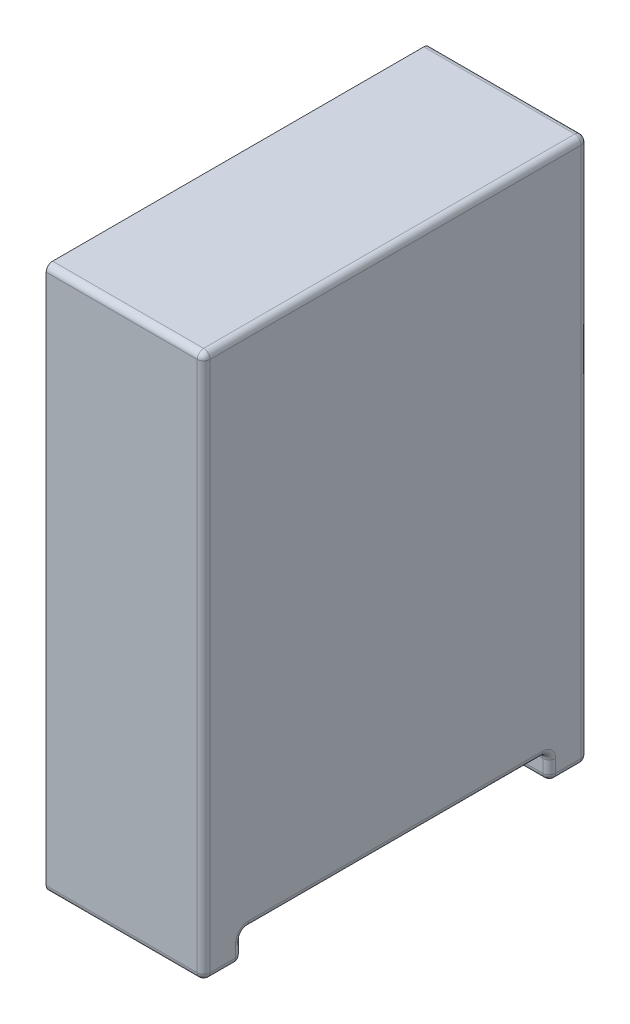
ISO-10303-21;
HEADER;
FILE_DESCRIPTION(('STEP AP214'),'2;1');
FILE_NAME('part.step','',(''),(''),'','','');
FILE_SCHEMA(('AUTOMOTIVE_DESIGN { 1 0 10303 214 1 1 1 1 }'));
ENDSEC;
DATA;
#1=APPLICATION_CONTEXT('core data for automotive mechanical design processes');
#2=APPLICATION_PROTOCOL_DEFINITION('international standard','automotive_design',2000,#1);
#3=PRODUCT_CONTEXT('',#1,'mechanical');
#4=PRODUCT('Part','Part','',(#3));
#5=PRODUCT_RELATED_PRODUCT_CATEGORY('part','',(#4));
#6=PRODUCT_DEFINITION_FORMATION('','',#4);
#7=PRODUCT_DEFINITION_CONTEXT('part definition',#1,'design');
#8=PRODUCT_DEFINITION('design','',#6,#7);
#9=PRODUCT_DEFINITION_SHAPE('','',#8);
#10=(LENGTH_UNIT() NAMED_UNIT(*) SI_UNIT(.MILLI.,.METRE.));
#11=(NAMED_UNIT(*) PLANE_ANGLE_UNIT() SI_UNIT($,.RADIAN.));
#12=(NAMED_UNIT(*) SI_UNIT($,.STERADIAN.) SOLID_ANGLE_UNIT());
#13=UNCERTAINTY_MEASURE_WITH_UNIT(LENGTH_MEASURE(1.E-05),#10,'distance_accuracy_value','');
#14=(GEOMETRIC_REPRESENTATION_CONTEXT(3) GLOBAL_UNCERTAINTY_ASSIGNED_CONTEXT((#13)) GLOBAL_UNIT_ASSIGNED_CONTEXT((#10,
#11,#12)) REPRESENTATION_CONTEXT('',''));
#15=CARTESIAN_POINT('',(0.,0.,0.));
#16=DIRECTION('',(0.,0.,1.));
#17=DIRECTION('',(1.,0.,0.));
#18=AXIS2_PLACEMENT_3D('',#15,#16,#17);
#19=CARTESIAN_POINT('',(-0.1,-4.35,-2.5));
#20=DIRECTION('',(1.,0.,0.));
#21=DIRECTION('',(0.,0.,-1.));
#22=AXIS2_PLACEMENT_3D('',#19,#20,#21);
#23=SPHERICAL_SURFACE('',#22,0.1);
#24=CARTESIAN_POINT('',(-0.1,-4.35,-2.5));
#25=DIRECTION('',(-1.,0.,0.));
#26=DIRECTION('',(0.,0.,1.));
#27=AXIS2_PLACEMENT_3D('',#24,#25,#26);
#28=CIRCLE('',#27,0.0999999999999998);
#29=CARTESIAN_POINT('',(-0.1,-4.45,-2.5));
#30=VERTEX_POINT('',#29);
#31=CARTESIAN_POINT('',(-0.0999999999999999,-4.35,-2.4));
#32=VERTEX_POINT('',#31);
#33=EDGE_CURVE('E94',#30,#32,#28,.T.);
#34=ORIENTED_EDGE('',*,*,#33,.F.);
#35=CARTESIAN_POINT('',(-0.1,-4.35,-2.5));
#36=DIRECTION('',(0.,0.,-1.));
#37=DIRECTION('',(-1.,0.,0.));
#38=AXIS2_PLACEMENT_3D('',#35,#36,#37);
#39=CIRCLE('',#38,0.1);
#40=CARTESIAN_POINT('',(0.,-4.35,-2.5));
#41=VERTEX_POINT('',#40);
#42=EDGE_CURVE('E161',#41,#30,#39,.T.);
#43=ORIENTED_EDGE('',*,*,#42,.F.);
#44=CARTESIAN_POINT('',(-0.0999999999999998,-4.35,-2.5));
#45=DIRECTION('',(0.,-1.,0.));
#46=DIRECTION('',(0.,0.,-1.));
#47=AXIS2_PLACEMENT_3D('',#44,#45,#46);
#48=CIRCLE('',#47,0.0999999999999998);
#49=EDGE_CURVE('E153',#32,#41,#48,.F.);
#50=ORIENTED_EDGE('',*,*,#49,.F.);
#51=EDGE_LOOP('',(#34,#43,#50));
#52=FACE_BOUND('',#51,.T.);
#53=ADVANCED_FACE('F17',(#52),#23,.T.);
#54=CARTESIAN_POINT('',(-0.1,-4.35,2.5));
#55=DIRECTION('',(1.,0.,0.));
#56=DIRECTION('',(0.,0.,-1.));
#57=AXIS2_PLACEMENT_3D('',#54,#55,#56);
#58=SPHERICAL_SURFACE('',#57,0.1);
#59=CARTESIAN_POINT('',(-0.1,-4.35,2.5));
#60=DIRECTION('',(0.,-1.,0.));
#61=DIRECTION('',(0.,0.,-1.));
#62=AXIS2_PLACEMENT_3D('',#59,#60,#61);
#63=CIRCLE('',#62,0.0999999999999998);
#64=CARTESIAN_POINT('',(0.,-4.35,2.5));
#65=VERTEX_POINT('',#64);
#66=CARTESIAN_POINT('',(-0.0999999999999999,-4.35,2.4));
#67=VERTEX_POINT('',#66);
#68=EDGE_CURVE('E162',#65,#67,#63,.F.);
#69=ORIENTED_EDGE('',*,*,#68,.F.);
#70=CARTESIAN_POINT('',(-0.1,-4.35,2.5));
#71=DIRECTION('',(0.,0.,1.));
#72=DIRECTION('',(1.,0.,0.));
#73=AXIS2_PLACEMENT_3D('',#70,#71,#72);
#74=CIRCLE('',#73,0.1);
#75=CARTESIAN_POINT('',(-0.1,-4.45,2.5));
#76=VERTEX_POINT('',#75);
#77=EDGE_CURVE('E269',#76,#65,#74,.T.);
#78=ORIENTED_EDGE('',*,*,#77,.F.);
#79=CARTESIAN_POINT('',(-0.1,-4.35,2.5));
#80=DIRECTION('',(-1.,0.,0.));
#81=DIRECTION('',(0.,0.,1.));
#82=AXIS2_PLACEMENT_3D('',#79,#80,#81);
#83=CIRCLE('',#82,0.0999999999999998);
#84=EDGE_CURVE('E528',#67,#76,#83,.T.);
#85=ORIENTED_EDGE('',*,*,#84,.F.);
#86=EDGE_LOOP('',(#69,#78,#85));
#87=FACE_BOUND('',#86,.T.);
#88=ADVANCED_FACE('F275',(#87),#58,.T.);
#89=CARTESIAN_POINT('',(0.,-4.35,-2.5));
#90=DIRECTION('',(-1.,0.,0.));
#91=DIRECTION('',(0.,0.,1.));
#92=AXIS2_PLACEMENT_3D('',#89,#90,#91);
#93=CYLINDRICAL_SURFACE('',#92,0.0999999999999998);
#94=ORIENTED_EDGE('',*,*,#33,.T.);
#95=DIRECTION('',(-1.,0.,0.));
#96=VECTOR('',#95,1.);
#97=CARTESIAN_POINT('',(-2.46,-4.35,-2.4));
#98=LINE('',#97,#96);
#99=CARTESIAN_POINT('',(-2.46,-4.35,-2.4));
#100=VERTEX_POINT('',#99);
#101=EDGE_CURVE('E204',#32,#100,#98,.T.);
#102=ORIENTED_EDGE('',*,*,#101,.T.);
#103=CARTESIAN_POINT('',(-2.46,-4.35,-2.5));
#104=DIRECTION('',(-1.,0.,0.));
#105=DIRECTION('',(0.,0.,1.));
#106=AXIS2_PLACEMENT_3D('',#103,#104,#105);
#107=CIRCLE('',#106,0.0999999999999998);
#108=CARTESIAN_POINT('',(-2.46,-4.45,-2.5));
#109=VERTEX_POINT('',#108);
#110=EDGE_CURVE('E21',#100,#109,#107,.F.);
#111=ORIENTED_EDGE('',*,*,#110,.T.);
#112=DIRECTION('',(1.,0.,0.));
#113=VECTOR('',#112,1.);
#114=CARTESIAN_POINT('',(0.,-4.45,-2.5));
#115=LINE('',#114,#113);
#116=EDGE_CURVE('E253',#109,#30,#115,.T.);
#117=ORIENTED_EDGE('',*,*,#116,.T.);
#118=EDGE_LOOP('',(#94,#102,#111,#117));
#119=FACE_BOUND('',#118,.T.);
#120=ADVANCED_FACE('F278',(#119),#93,.T.);
#121=CARTESIAN_POINT('',(-0.1,0.,2.5));
#122=DIRECTION('',(0.,-1.,0.));
#123=DIRECTION('',(0.,0.,-1.));
#124=AXIS2_PLACEMENT_3D('',#121,#122,#123);
#125=CYLINDRICAL_SURFACE('',#124,0.0999999999999998);
#126=ORIENTED_EDGE('',*,*,#68,.T.);
#127=DIRECTION('',(0.,1.,0.));
#128=VECTOR('',#127,1.);
#129=CARTESIAN_POINT('',(-0.0999999999999998,-4.45,2.4));
#130=LINE('',#129,#128);
#131=CARTESIAN_POINT('',(-0.0999999999999998,-4.15,2.4));
#132=VERTEX_POINT('',#131);
#133=EDGE_CURVE('E268',#67,#132,#130,.T.);
#134=ORIENTED_EDGE('',*,*,#133,.T.);
#135=CARTESIAN_POINT('',(-0.0999999999999998,-4.15,2.5));
#136=DIRECTION('',(0.,-1.,0.));
#137=DIRECTION('',(0.,0.,1.));
#138=AXIS2_PLACEMENT_3D('',#135,#136,#137);
#139=CIRCLE('',#138,0.1);
#140=CARTESIAN_POINT('',(0.,-4.15,2.5));
#141=VERTEX_POINT('',#140);
#142=EDGE_CURVE('E676',#141,#132,#139,.F.);
#143=ORIENTED_EDGE('',*,*,#142,.F.);
#144=DIRECTION('',(0.,1.,0.));
#145=VECTOR('',#144,1.);
#146=CARTESIAN_POINT('',(0.,0.,2.5));
#147=LINE('',#146,#145);
#148=EDGE_CURVE('E421',#65,#141,#147,.T.);
#149=ORIENTED_EDGE('',*,*,#148,.F.);
#150=EDGE_LOOP('',(#126,#134,#143,#149));
#151=FACE_BOUND('',#150,.T.);
#152=ADVANCED_FACE('F282',(#151),#125,.T.);
#153=CARTESIAN_POINT('',(-0.0999999999999998,-4.45,-2.5));
#154=DIRECTION('',(0.,-1.,0.));
#155=DIRECTION('',(0.,0.,-1.));
#156=AXIS2_PLACEMENT_3D('',#153,#154,#155);
#157=CYLINDRICAL_SURFACE('',#156,0.0999999999999998);
#158=ORIENTED_EDGE('',*,*,#49,.T.);
#159=DIRECTION('',(0.,1.,0.));
#160=VECTOR('',#159,1.);
#161=CARTESIAN_POINT('',(0.,0.,-2.5));
#162=LINE('',#161,#160);
#163=CARTESIAN_POINT('',(0.,-4.15,-2.5));
#164=VERTEX_POINT('',#163);
#165=EDGE_CURVE('E157',#164,#41,#162,.F.);
#166=ORIENTED_EDGE('',*,*,#165,.F.);
#167=CARTESIAN_POINT('',(-0.0999999999999998,-4.15,-2.5));
#168=DIRECTION('',(0.,1.,0.));
#169=DIRECTION('',(0.,0.,-1.));
#170=AXIS2_PLACEMENT_3D('',#167,#168,#169);
#171=CIRCLE('',#170,0.1);
#172=CARTESIAN_POINT('',(-0.0999999999999999,-4.15,-2.4));
#173=VERTEX_POINT('',#172);
#174=EDGE_CURVE('E210',#173,#164,#171,.T.);
#175=ORIENTED_EDGE('',*,*,#174,.F.);
#176=DIRECTION('',(0.,1.,0.));
#177=VECTOR('',#176,1.);
#178=CARTESIAN_POINT('',(-0.0999999999999998,-4.45,-2.4));
#179=LINE('',#178,#177);
#180=EDGE_CURVE('E158',#173,#32,#179,.F.);
#181=ORIENTED_EDGE('',*,*,#180,.T.);
#182=EDGE_LOOP('',(#158,#166,#175,#181));
#183=FACE_BOUND('',#182,.T.);
#184=ADVANCED_FACE('F155',(#183),#157,.T.);
#185=CARTESIAN_POINT('',(-0.1,-4.35,0.));
#186=DIRECTION('',(0.,0.,-1.));
#187=DIRECTION('',(-1.,0.,0.));
#188=AXIS2_PLACEMENT_3D('',#185,#186,#187);
#189=CYLINDRICAL_SURFACE('',#188,0.1);
#190=CARTESIAN_POINT('',(-0.1,-4.35,-2.9));
#191=DIRECTION('',(0.,-3.06654318155864E-11,-1.));
#192=DIRECTION('',(1.,0.,0.));
#193=AXIS2_PLACEMENT_3D('',#190,#191,#192);
#194=CIRCLE('',#193,0.1);
#195=CARTESIAN_POINT('',(0.,-4.35,-2.9));
#196=VERTEX_POINT('',#195);
#197=CARTESIAN_POINT('',(-0.1,-4.45,-2.89999999999923));
#198=VERTEX_POINT('',#197);
#199=EDGE_CURVE('E183',#196,#198,#194,.T.);
#200=ORIENTED_EDGE('',*,*,#199,.F.);
#201=DIRECTION('',(0.,0.,-1.));
#202=VECTOR('',#201,1.);
#203=CARTESIAN_POINT('',(0.,-4.35,0.));
#204=LINE('',#203,#202);
#205=EDGE_CURVE('E170',#41,#196,#204,.T.);
#206=ORIENTED_EDGE('',*,*,#205,.F.);
#207=ORIENTED_EDGE('',*,*,#42,.T.);
#208=DIRECTION('',(0.,0.,1.));
#209=VECTOR('',#208,1.);
#210=CARTESIAN_POINT('',(-0.1,-4.45,0.));
#211=LINE('',#210,#209);
#212=EDGE_CURVE('E255',#30,#198,#211,.F.);
#213=ORIENTED_EDGE('',*,*,#212,.T.);
#214=EDGE_LOOP('',(#200,#206,#207,#213));
#215=FACE_BOUND('',#214,.T.);
#216=ADVANCED_FACE('F182',(#215),#189,.T.);
#217=CARTESIAN_POINT('',(0.,-4.35,2.5));
#218=DIRECTION('',(-1.,0.,0.));
#219=DIRECTION('',(0.,0.,1.));
#220=AXIS2_PLACEMENT_3D('',#217,#218,#219);
#221=CYLINDRICAL_SURFACE('',#220,0.0999999999999998);
#222=ORIENTED_EDGE('',*,*,#84,.T.);
#223=DIRECTION('',(1.,0.,0.));
#224=VECTOR('',#223,1.);
#225=CARTESIAN_POINT('',(0.,-4.45,2.5));
#226=LINE('',#225,#224);
#227=CARTESIAN_POINT('',(-2.46,-4.45,2.5));
#228=VERTEX_POINT('',#227);
#229=EDGE_CURVE('E378',#228,#76,#226,.T.);
#230=ORIENTED_EDGE('',*,*,#229,.F.);
#231=CARTESIAN_POINT('',(-2.46,-4.35,2.5));
#232=DIRECTION('',(-1.,0.,0.));
#233=DIRECTION('',(0.,0.,1.));
#234=AXIS2_PLACEMENT_3D('',#231,#232,#233);
#235=CIRCLE('',#234,0.0999999999999998);
#236=CARTESIAN_POINT('',(-2.46,-4.35,2.4));
#237=VERTEX_POINT('',#236);
#238=EDGE_CURVE('E180',#228,#237,#235,.F.);
#239=ORIENTED_EDGE('',*,*,#238,.T.);
#240=DIRECTION('',(1.,0.,0.));
#241=VECTOR('',#240,1.);
#242=CARTESIAN_POINT('',(-2.46,-4.35,2.4));
#243=LINE('',#242,#241);
#244=EDGE_CURVE('E265',#237,#67,#243,.T.);
#245=ORIENTED_EDGE('',*,*,#244,.T.);
#246=EDGE_LOOP('',(#222,#230,#239,#245));
#247=FACE_BOUND('',#246,.T.);
#248=ADVANCED_FACE('F290',(#247),#221,.T.);
#249=CARTESIAN_POINT('',(-0.1,-4.35,0.));
#250=DIRECTION('',(0.,0.,1.));
#251=DIRECTION('',(1.,0.,0.));
#252=AXIS2_PLACEMENT_3D('',#249,#250,#251);
#253=CYLINDRICAL_SURFACE('',#252,0.1);
#254=CARTESIAN_POINT('',(-0.1,-4.35,2.9));
#255=DIRECTION('',(0.,0.,-1.));
#256=DIRECTION('',(1.,0.,0.));
#257=AXIS2_PLACEMENT_3D('',#254,#255,#256);
#258=CIRCLE('',#257,0.1);
#259=CARTESIAN_POINT('',(-0.1,-4.45,2.9));
#260=VERTEX_POINT('',#259);
#261=CARTESIAN_POINT('',(0.,-4.35,2.9));
#262=VERTEX_POINT('',#261);
#263=EDGE_CURVE('E124',#260,#262,#258,.F.);
#264=ORIENTED_EDGE('',*,*,#263,.F.);
#265=DIRECTION('',(0.,0.,-1.));
#266=VECTOR('',#265,1.);
#267=CARTESIAN_POINT('',(-0.1,-4.45,0.));
#268=LINE('',#267,#266);
#269=EDGE_CURVE('E185',#76,#260,#268,.F.);
#270=ORIENTED_EDGE('',*,*,#269,.F.);
#271=ORIENTED_EDGE('',*,*,#77,.T.);
#272=DIRECTION('',(0.,0.,-1.));
#273=VECTOR('',#272,1.);
#274=CARTESIAN_POINT('',(0.,-4.35,0.));
#275=LINE('',#274,#273);
#276=EDGE_CURVE('E423',#262,#65,#275,.T.);
#277=ORIENTED_EDGE('',*,*,#276,.F.);
#278=EDGE_LOOP('',(#264,#270,#271,#277));
#279=FACE_BOUND('',#278,.T.);
#280=ADVANCED_FACE('F293',(#279),#253,.T.);
#281=CARTESIAN_POINT('',(-2.46,-4.45,2.4));
#282=DIRECTION('',(0.,0.,1.));
#283=DIRECTION('',(1.,0.,0.));
#284=AXIS2_PLACEMENT_3D('',#281,#282,#283);
#285=PLANE('',#284);
#286=DIRECTION('',(1.,0.,0.));
#287=VECTOR('',#286,1.);
#288=CARTESIAN_POINT('',(-2.46,-4.15,2.4));
#289=LINE('',#288,#287);
#290=CARTESIAN_POINT('',(-2.46,-4.15,2.4));
#291=VERTEX_POINT('',#290);
#292=EDGE_CURVE('E502',#291,#132,#289,.T.);
#293=ORIENTED_EDGE('',*,*,#292,.T.);
#294=ORIENTED_EDGE('',*,*,#133,.F.);
#295=ORIENTED_EDGE('',*,*,#244,.F.);
#296=DIRECTION('',(0.,1.,0.));
#297=VECTOR('',#296,1.);
#298=CARTESIAN_POINT('',(-2.46,-4.45,2.4));
#299=LINE('',#298,#297);
#300=EDGE_CURVE('E679',#291,#237,#299,.F.);
#301=ORIENTED_EDGE('',*,*,#300,.F.);
#302=EDGE_LOOP('',(#293,#294,#295,#301));
#303=FACE_BOUND('',#302,.T.);
#304=ADVANCED_FACE('F296',(#303),#285,.F.);
#305=CARTESIAN_POINT('',(-0.0999999999999998,-4.15,2.3));
#306=DIRECTION('',(1.,0.,0.));
#307=DIRECTION('',(0.,0.,-1.));
#308=AXIS2_PLACEMENT_3D('',#305,#306,#307);
#309=TOROIDAL_SURFACE('',#308,0.2,0.1);
#310=ORIENTED_EDGE('',*,*,#142,.T.);
#311=CARTESIAN_POINT('',(-0.0999999999999998,-4.15,2.3));
#312=DIRECTION('',(1.,0.,0.));
#313=DIRECTION('',(0.,0.,-1.));
#314=AXIS2_PLACEMENT_3D('',#311,#312,#313);
#315=CIRCLE('',#314,0.0999999999999998);
#316=CARTESIAN_POINT('',(-0.0999999999999999,-4.05,2.3));
#317=VERTEX_POINT('',#316);
#318=EDGE_CURVE('E499',#132,#317,#315,.F.);
#319=ORIENTED_EDGE('',*,*,#318,.T.);
#320=CARTESIAN_POINT('',(-0.1,-3.95,2.3));
#321=DIRECTION('',(0.,0.,-1.));
#322=DIRECTION('',(-1.,0.,0.));
#323=AXIS2_PLACEMENT_3D('',#320,#321,#322);
#324=CIRCLE('',#323,0.1);
#325=CARTESIAN_POINT('',(0.,-3.95,2.3));
#326=VERTEX_POINT('',#325);
#327=EDGE_CURVE('E509',#326,#317,#324,.T.);
#328=ORIENTED_EDGE('',*,*,#327,.F.);
#329=CARTESIAN_POINT('',(0.,-4.15,2.3));
#330=DIRECTION('',(1.,0.,0.));
#331=DIRECTION('',(0.,1.,0.));
#332=AXIS2_PLACEMENT_3D('',#329,#330,#331);
#333=CIRCLE('',#332,0.200000000000001);
#334=EDGE_CURVE('E241',#141,#326,#333,.F.);
#335=ORIENTED_EDGE('',*,*,#334,.F.);
#336=EDGE_LOOP('',(#310,#319,#328,#335));
#337=FACE_BOUND('',#336,.T.);
#338=ADVANCED_FACE('F219',(#337),#309,.T.);
#339=CARTESIAN_POINT('',(-0.0999999999999998,-4.15,-2.3));
#340=DIRECTION('',(1.,0.,0.));
#341=DIRECTION('',(0.,0.,-1.));
#342=AXIS2_PLACEMENT_3D('',#339,#340,#341);
#343=TOROIDAL_SURFACE('',#342,0.2,0.1);
#344=CARTESIAN_POINT('',(-0.1,-3.95,-2.3));
#345=DIRECTION('',(0.,0.,-1.));
#346=DIRECTION('',(-1.,0.,0.));
#347=AXIS2_PLACEMENT_3D('',#344,#345,#346);
#348=CIRCLE('',#347,0.1);
#349=CARTESIAN_POINT('',(-0.0999999999999999,-4.05,-2.3));
#350=VERTEX_POINT('',#349);
#351=CARTESIAN_POINT('',(0.,-3.95,-2.3));
#352=VERTEX_POINT('',#351);
#353=EDGE_CURVE('E377',#350,#352,#348,.F.);
#354=ORIENTED_EDGE('',*,*,#353,.F.);
#355=CARTESIAN_POINT('',(-0.0999999999999998,-4.15,-2.3));
#356=DIRECTION('',(-1.,0.,0.));
#357=DIRECTION('',(0.,0.,1.));
#358=AXIS2_PLACEMENT_3D('',#355,#356,#357);
#359=CIRCLE('',#358,0.0999999999999998);
#360=EDGE_CURVE('E199',#350,#173,#359,.T.);
#361=ORIENTED_EDGE('',*,*,#360,.T.);
#362=ORIENTED_EDGE('',*,*,#174,.T.);
#363=CARTESIAN_POINT('',(0.,-4.15,-2.3));
#364=DIRECTION('',(1.,0.,0.));
#365=DIRECTION('',(0.,0.,-1.));
#366=AXIS2_PLACEMENT_3D('',#363,#364,#365);
#367=CIRCLE('',#366,0.2);
#368=EDGE_CURVE('E174',#352,#164,#367,.F.);
#369=ORIENTED_EDGE('',*,*,#368,.F.);
#370=EDGE_LOOP('',(#354,#361,#362,#369));
#371=FACE_BOUND('',#370,.T.);
#372=ADVANCED_FACE('F213',(#371),#343,.T.);
#373=CARTESIAN_POINT('',(-2.46,-4.45,-2.4));
#374=DIRECTION('',(0.,0.,-1.));
#375=DIRECTION('',(-1.,0.,0.));
#376=AXIS2_PLACEMENT_3D('',#373,#374,#375);
#377=PLANE('',#376);
#378=DIRECTION('',(-1.,0.,0.));
#379=VECTOR('',#378,1.);
#380=CARTESIAN_POINT('',(-2.46,-4.15,-2.4));
#381=LINE('',#380,#379);
#382=CARTESIAN_POINT('',(-2.46,-4.15,-2.4));
#383=VERTEX_POINT('',#382);
#384=EDGE_CURVE('E195',#173,#383,#381,.T.);
#385=ORIENTED_EDGE('',*,*,#384,.T.);
#386=DIRECTION('',(0.,1.,0.));
#387=VECTOR('',#386,1.);
#388=CARTESIAN_POINT('',(-2.46,-4.45,-2.4));
#389=LINE('',#388,#387);
#390=EDGE_CURVE('E202',#100,#383,#389,.T.);
#391=ORIENTED_EDGE('',*,*,#390,.F.);
#392=ORIENTED_EDGE('',*,*,#101,.F.);
#393=ORIENTED_EDGE('',*,*,#180,.F.);
#394=EDGE_LOOP('',(#385,#391,#392,#393));
#395=FACE_BOUND('',#394,.T.);
#396=ADVANCED_FACE('F218',(#395),#377,.F.);
#397=CARTESIAN_POINT('',(-0.1,-4.35,-2.9));
#398=DIRECTION('',(1.,0.,0.));
#399=DIRECTION('',(0.,0.,-1.));
#400=AXIS2_PLACEMENT_3D('',#397,#398,#399);
#401=SPHERICAL_SURFACE('',#400,0.1);
#402=CARTESIAN_POINT('',(-0.1,-4.35,-2.9));
#403=DIRECTION('',(-1.,0.,0.));
#404=DIRECTION('',(0.,0.,1.));
#405=AXIS2_PLACEMENT_3D('',#402,#403,#404);
#406=CIRCLE('',#405,0.0999999999999998);
#407=CARTESIAN_POINT('',(-0.0999999999999999,-4.35,-3.));
#408=VERTEX_POINT('',#407);
#409=EDGE_CURVE('E472',#408,#198,#406,.T.);
#410=ORIENTED_EDGE('',*,*,#409,.F.);
#411=CARTESIAN_POINT('',(-0.1,-4.35,-2.9));
#412=DIRECTION('',(0.,1.,0.));
#413=DIRECTION('',(0.,0.,1.));
#414=AXIS2_PLACEMENT_3D('',#411,#412,#413);
#415=CIRCLE('',#414,0.0999999999999998);
#416=EDGE_CURVE('E474',#196,#408,#415,.T.);
#417=ORIENTED_EDGE('',*,*,#416,.F.);
#418=ORIENTED_EDGE('',*,*,#199,.T.);
#419=EDGE_LOOP('',(#410,#417,#418));
#420=FACE_BOUND('',#419,.T.);
#421=ADVANCED_FACE('F447',(#420),#401,.T.);
#422=CARTESIAN_POINT('',(0.,-4.45,0.));
#423=DIRECTION('',(0.,1.,0.));
#424=DIRECTION('',(0.,0.,1.));
#425=AXIS2_PLACEMENT_3D('',#422,#423,#424);
#426=PLANE('',#425);
#427=ORIENTED_EDGE('',*,*,#116,.F.);
#428=DIRECTION('',(0.,0.,1.));
#429=VECTOR('',#428,1.);
#430=CARTESIAN_POINT('',(-2.46,-4.45,0.));
#431=LINE('',#430,#429);
#432=CARTESIAN_POINT('',(-2.46,-4.45,-2.9));
#433=VERTEX_POINT('',#432);
#434=EDGE_CURVE('E256',#433,#109,#431,.T.);
#435=ORIENTED_EDGE('',*,*,#434,.F.);
#436=DIRECTION('',(-1.,0.,0.));
#437=VECTOR('',#436,1.);
#438=CARTESIAN_POINT('',(0.,-4.45,-2.9));
#439=LINE('',#438,#437);
#440=EDGE_CURVE('E581',#198,#433,#439,.T.);
#441=ORIENTED_EDGE('',*,*,#440,.F.);
#442=ORIENTED_EDGE('',*,*,#212,.F.);
#443=EDGE_LOOP('',(#427,#435,#441,#442));
#444=FACE_BOUND('',#443,.T.);
#445=ADVANCED_FACE('F449',(#444),#426,.F.);
#446=CARTESIAN_POINT('',(-0.1,3.95,-2.9));
#447=DIRECTION('',(1.,0.,0.));
#448=DIRECTION('',(0.,0.,-1.));
#449=AXIS2_PLACEMENT_3D('',#446,#447,#448);
#450=SPHERICAL_SURFACE('',#449,0.1);
#451=CARTESIAN_POINT('',(-0.0999999999999998,3.95,-2.9));
#452=DIRECTION('',(1.,0.,0.));
#453=DIRECTION('',(0.,0.,-1.));
#454=AXIS2_PLACEMENT_3D('',#451,#452,#453);
#455=CIRCLE('',#454,0.0999999999999998);
#456=CARTESIAN_POINT('',(-0.0999999999999999,4.05,-2.9));
#457=VERTEX_POINT('',#456);
#458=CARTESIAN_POINT('',(-0.0999999999999999,3.95,-3.));
#459=VERTEX_POINT('',#458);
#460=EDGE_CURVE('E546',#457,#459,#455,.F.);
#461=ORIENTED_EDGE('',*,*,#460,.F.);
#462=CARTESIAN_POINT('',(-0.1,3.95,-2.9));
#463=DIRECTION('',(0.,0.,1.));
#464=DIRECTION('',(1.,0.,0.));
#465=AXIS2_PLACEMENT_3D('',#462,#463,#464);
#466=CIRCLE('',#465,0.1);
#467=CARTESIAN_POINT('',(0.,3.95,-2.9));
#468=VERTEX_POINT('',#467);
#469=EDGE_CURVE('E578',#468,#457,#466,.T.);
#470=ORIENTED_EDGE('',*,*,#469,.F.);
#471=CARTESIAN_POINT('',(-0.1,3.95,-2.9));
#472=DIRECTION('',(0.,1.,0.));
#473=DIRECTION('',(0.,0.,1.));
#474=AXIS2_PLACEMENT_3D('',#471,#472,#473);
#475=CIRCLE('',#474,0.0999999999999998);
#476=EDGE_CURVE('E468',#459,#468,#475,.F.);
#477=ORIENTED_EDGE('',*,*,#476,.F.);
#478=EDGE_LOOP('',(#461,#470,#477));
#479=FACE_BOUND('',#478,.T.);
#480=ADVANCED_FACE('F399',(#479),#450,.T.);
#481=CARTESIAN_POINT('',(0.,0.,0.));
#482=DIRECTION('',(1.,0.,0.));
#483=DIRECTION('',(0.,0.,-1.));
#484=AXIS2_PLACEMENT_3D('',#481,#482,#483);
#485=PLANE('',#484);
#486=DIRECTION('',(0.,0.,1.));
#487=VECTOR('',#486,1.);
#488=CARTESIAN_POINT('',(0.,3.95,0.));
#489=LINE('',#488,#487);
#490=CARTESIAN_POINT('',(0.,3.95,2.9));
#491=VERTEX_POINT('',#490);
#492=EDGE_CURVE('E437',#491,#468,#489,.F.);
#493=ORIENTED_EDGE('',*,*,#492,.F.);
#494=DIRECTION('',(0.,-1.,0.));
#495=VECTOR('',#494,1.);
#496=CARTESIAN_POINT('',(0.,0.,2.9));
#497=LINE('',#496,#495);
#498=EDGE_CURVE('E430',#262,#491,#497,.F.);
#499=ORIENTED_EDGE('',*,*,#498,.F.);
#500=ORIENTED_EDGE('',*,*,#276,.T.);
#501=ORIENTED_EDGE('',*,*,#148,.T.);
#502=ORIENTED_EDGE('',*,*,#334,.T.);
#503=DIRECTION('',(0.,0.,-1.));
#504=VECTOR('',#503,1.);
#505=CARTESIAN_POINT('',(0.,-3.95,0.));
#506=LINE('',#505,#504);
#507=EDGE_CURVE('E507',#352,#326,#506,.F.);
#508=ORIENTED_EDGE('',*,*,#507,.F.);
#509=ORIENTED_EDGE('',*,*,#368,.T.);
#510=ORIENTED_EDGE('',*,*,#165,.T.);
#511=ORIENTED_EDGE('',*,*,#205,.T.);
#512=DIRECTION('',(0.,1.,0.));
#513=VECTOR('',#512,1.);
#514=CARTESIAN_POINT('',(0.,0.,-2.9));
#515=LINE('',#514,#513);
#516=EDGE_CURVE('E467',#468,#196,#515,.F.);
#517=ORIENTED_EDGE('',*,*,#516,.F.);
#518=EDGE_LOOP('',(#493,#499,#500,#501,#502,#508,#509,#510,#511,#517));
#519=FACE_BOUND('',#518,.T.);
#520=ADVANCED_FACE('F167',(#519),#485,.T.);
#521=CARTESIAN_POINT('',(-0.1,3.95,2.9));
#522=DIRECTION('',(1.,0.,0.));
#523=DIRECTION('',(0.,0.,-1.));
#524=AXIS2_PLACEMENT_3D('',#521,#522,#523);
#525=SPHERICAL_SURFACE('',#524,0.1);
#526=CARTESIAN_POINT('',(-0.0999999999999998,3.95,2.9));
#527=DIRECTION('',(1.,0.,0.));
#528=DIRECTION('',(0.,0.,-1.));
#529=AXIS2_PLACEMENT_3D('',#526,#527,#528);
#530=CIRCLE('',#529,0.0999999999999998);
#531=CARTESIAN_POINT('',(-0.0999999999999999,3.95,3.));
#532=VERTEX_POINT('',#531);
#533=CARTESIAN_POINT('',(-0.0999999999999998,4.05,2.9));
#534=VERTEX_POINT('',#533);
#535=EDGE_CURVE('E547',#532,#534,#530,.F.);
#536=ORIENTED_EDGE('',*,*,#535,.F.);
#537=CARTESIAN_POINT('',(-0.1,3.95,2.9));
#538=DIRECTION('',(0.,-1.,0.));
#539=DIRECTION('',(0.,0.,-1.));
#540=AXIS2_PLACEMENT_3D('',#537,#538,#539);
#541=CIRCLE('',#540,0.0999999999999998);
#542=EDGE_CURVE('E560',#491,#532,#541,.T.);
#543=ORIENTED_EDGE('',*,*,#542,.F.);
#544=CARTESIAN_POINT('',(-0.1,3.95,2.9));
#545=DIRECTION('',(0.,0.,1.));
#546=DIRECTION('',(1.,0.,0.));
#547=AXIS2_PLACEMENT_3D('',#544,#545,#546);
#548=CIRCLE('',#547,0.1);
#549=EDGE_CURVE('E441',#534,#491,#548,.F.);
#550=ORIENTED_EDGE('',*,*,#549,.F.);
#551=EDGE_LOOP('',(#536,#543,#550));
#552=FACE_BOUND('',#551,.T.);
#553=ADVANCED_FACE('F392',(#552),#525,.T.);
#554=CARTESIAN_POINT('',(0.,-4.45,0.));
#555=DIRECTION('',(0.,-1.,0.));
#556=DIRECTION('',(0.,0.,-1.));
#557=AXIS2_PLACEMENT_3D('',#554,#555,#556);
#558=PLANE('',#557);
#559=DIRECTION('',(0.,0.,-1.));
#560=VECTOR('',#559,1.);
#561=CARTESIAN_POINT('',(-2.46,-4.45,0.));
#562=LINE('',#561,#560);
#563=CARTESIAN_POINT('',(-2.46,-4.45,2.9));
#564=VERTEX_POINT('',#563);
#565=EDGE_CURVE('E187',#564,#228,#562,.T.);
#566=ORIENTED_EDGE('',*,*,#565,.T.);
#567=ORIENTED_EDGE('',*,*,#229,.T.);
#568=ORIENTED_EDGE('',*,*,#269,.T.);
#569=DIRECTION('',(-1.,0.,0.));
#570=VECTOR('',#569,1.);
#571=CARTESIAN_POINT('',(0.,-4.45,2.9));
#572=LINE('',#571,#570);
#573=EDGE_CURVE('E381',#564,#260,#572,.F.);
#574=ORIENTED_EDGE('',*,*,#573,.F.);
#575=EDGE_LOOP('',(#566,#567,#568,#574));
#576=FACE_BOUND('',#575,.T.);
#577=ADVANCED_FACE('F369',(#576),#558,.T.);
#578=CARTESIAN_POINT('',(-0.1,-4.35,2.9));
#579=DIRECTION('',(1.,0.,0.));
#580=DIRECTION('',(0.,0.,-1.));
#581=AXIS2_PLACEMENT_3D('',#578,#579,#580);
#582=SPHERICAL_SURFACE('',#581,0.1);
#583=ORIENTED_EDGE('',*,*,#263,.T.);
#584=CARTESIAN_POINT('',(-0.1,-4.35,2.9));
#585=DIRECTION('',(0.,-1.,0.));
#586=DIRECTION('',(0.,0.,-1.));
#587=AXIS2_PLACEMENT_3D('',#584,#585,#586);
#588=CIRCLE('',#587,0.0999999999999998);
#589=CARTESIAN_POINT('',(-0.0999999999999999,-4.35,3.));
#590=VERTEX_POINT('',#589);
#591=EDGE_CURVE('E433',#590,#262,#588,.F.);
#592=ORIENTED_EDGE('',*,*,#591,.F.);
#593=CARTESIAN_POINT('',(-0.1,-4.35,2.9));
#594=DIRECTION('',(-1.,0.,0.));
#595=DIRECTION('',(0.,0.,1.));
#596=AXIS2_PLACEMENT_3D('',#593,#594,#595);
#597=CIRCLE('',#596,0.0999999999999998);
#598=EDGE_CURVE('E383',#260,#590,#597,.T.);
#599=ORIENTED_EDGE('',*,*,#598,.F.);
#600=EDGE_LOOP('',(#583,#592,#599));
#601=FACE_BOUND('',#600,.T.);
#602=ADVANCED_FACE('F364',(#601),#582,.T.);
#603=CARTESIAN_POINT('',(-0.1,-3.95,0.));
#604=DIRECTION('',(0.,0.,-1.));
#605=DIRECTION('',(-1.,0.,0.));
#606=AXIS2_PLACEMENT_3D('',#603,#604,#605);
#607=CYLINDRICAL_SURFACE('',#606,0.1);
#608=ORIENTED_EDGE('',*,*,#327,.T.);
#609=DIRECTION('',(0.,0.,-1.));
#610=VECTOR('',#609,1.);
#611=CARTESIAN_POINT('',(-0.0999999999999998,-4.05,3.));
#612=LINE('',#611,#610);
#613=EDGE_CURVE('E493',#350,#317,#612,.F.);
#614=ORIENTED_EDGE('',*,*,#613,.F.);
#615=ORIENTED_EDGE('',*,*,#353,.T.);
#616=ORIENTED_EDGE('',*,*,#507,.T.);
#617=EDGE_LOOP('',(#608,#614,#615,#616));
#618=FACE_BOUND('',#617,.T.);
#619=ADVANCED_FACE('F360',(#618),#607,.T.);
#620=CARTESIAN_POINT('',(-2.46,-4.15,2.3));
#621=DIRECTION('',(1.,0.,0.));
#622=DIRECTION('',(0.,0.,-1.));
#623=AXIS2_PLACEMENT_3D('',#620,#621,#622);
#624=CYLINDRICAL_SURFACE('',#623,0.0999999999999998);
#625=DIRECTION('',(1.,0.,0.));
#626=VECTOR('',#625,1.);
#627=CARTESIAN_POINT('',(-2.46,-4.05,2.3));
#628=LINE('',#627,#626);
#629=CARTESIAN_POINT('',(-2.46,-4.05,2.3));
#630=VERTEX_POINT('',#629);
#631=EDGE_CURVE('E496',#317,#630,#628,.F.);
#632=ORIENTED_EDGE('',*,*,#631,.F.);
#633=ORIENTED_EDGE('',*,*,#318,.F.);
#634=ORIENTED_EDGE('',*,*,#292,.F.);
#635=CARTESIAN_POINT('',(-2.46,-4.15,2.3));
#636=DIRECTION('',(1.,0.,0.));
#637=DIRECTION('',(0.,0.,-1.));
#638=AXIS2_PLACEMENT_3D('',#635,#636,#637);
#639=CIRCLE('',#638,0.0999999999999998);
#640=EDGE_CURVE('E490',#630,#291,#639,.T.);
#641=ORIENTED_EDGE('',*,*,#640,.F.);
#642=EDGE_LOOP('',(#632,#633,#634,#641));
#643=FACE_BOUND('',#642,.T.);
#644=ADVANCED_FACE('F356',(#643),#624,.F.);
#645=CARTESIAN_POINT('',(-2.46,-4.15,-2.3));
#646=DIRECTION('',(-1.,0.,0.));
#647=DIRECTION('',(0.,0.,1.));
#648=AXIS2_PLACEMENT_3D('',#645,#646,#647);
#649=CYLINDRICAL_SURFACE('',#648,0.0999999999999998);
#650=ORIENTED_EDGE('',*,*,#384,.F.);
#651=ORIENTED_EDGE('',*,*,#360,.F.);
#652=DIRECTION('',(1.,0.,0.));
#653=VECTOR('',#652,1.);
#654=CARTESIAN_POINT('',(-2.46,-4.05,-2.3));
#655=LINE('',#654,#653);
#656=CARTESIAN_POINT('',(-2.46,-4.05,-2.3));
#657=VERTEX_POINT('',#656);
#658=EDGE_CURVE('E591',#657,#350,#655,.T.);
#659=ORIENTED_EDGE('',*,*,#658,.F.);
#660=CARTESIAN_POINT('',(-2.46,-4.15,-2.3));
#661=DIRECTION('',(-1.,0.,0.));
#662=DIRECTION('',(0.,0.,1.));
#663=AXIS2_PLACEMENT_3D('',#660,#661,#662);
#664=CIRCLE('',#663,0.0999999999999998);
#665=EDGE_CURVE('E198',#383,#657,#664,.F.);
#666=ORIENTED_EDGE('',*,*,#665,.F.);
#667=EDGE_LOOP('',(#650,#651,#659,#666));
#668=FACE_BOUND('',#667,.T.);
#669=ADVANCED_FACE('F352',(#668),#649,.F.);
#670=CARTESIAN_POINT('',(-0.1,0.,-2.9));
#671=DIRECTION('',(0.,1.,0.));
#672=DIRECTION('',(0.,0.,1.));
#673=AXIS2_PLACEMENT_3D('',#670,#671,#672);
#674=CYLINDRICAL_SURFACE('',#673,0.0999999999999998);
#675=ORIENTED_EDGE('',*,*,#476,.T.);
#676=ORIENTED_EDGE('',*,*,#516,.T.);
#677=ORIENTED_EDGE('',*,*,#416,.T.);
#678=DIRECTION('',(0.,1.,0.));
#679=VECTOR('',#678,1.);
#680=CARTESIAN_POINT('',(-0.0999999999999998,4.05,-3.));
#681=LINE('',#680,#679);
#682=EDGE_CURVE('E587',#459,#408,#681,.F.);
#683=ORIENTED_EDGE('',*,*,#682,.F.);
#684=EDGE_LOOP('',(#675,#676,#677,#683));
#685=FACE_BOUND('',#684,.T.);
#686=ADVANCED_FACE('F348',(#685),#674,.T.);
#687=CARTESIAN_POINT('',(0.,-4.35,-2.9));
#688=DIRECTION('',(-1.,0.,0.));
#689=DIRECTION('',(0.,0.,1.));
#690=AXIS2_PLACEMENT_3D('',#687,#688,#689);
#691=CYLINDRICAL_SURFACE('',#690,0.0999999999999998);
#692=ORIENTED_EDGE('',*,*,#409,.T.);
#693=ORIENTED_EDGE('',*,*,#440,.T.);
#694=CARTESIAN_POINT('',(-2.46,-4.35,-2.9));
#695=DIRECTION('',(-1.,0.,0.));
#696=DIRECTION('',(0.,0.,1.));
#697=AXIS2_PLACEMENT_3D('',#694,#695,#696);
#698=CIRCLE('',#697,0.0999999999999998);
#699=CARTESIAN_POINT('',(-2.46,-4.35,-3.));
#700=VERTEX_POINT('',#699);
#701=EDGE_CURVE('E462',#433,#700,#698,.F.);
#702=ORIENTED_EDGE('',*,*,#701,.T.);
#703=DIRECTION('',(1.,0.,0.));
#704=VECTOR('',#703,1.);
#705=CARTESIAN_POINT('',(-2.46,-4.35,-3.));
#706=LINE('',#705,#704);
#707=EDGE_CURVE('E590',#408,#700,#706,.F.);
#708=ORIENTED_EDGE('',*,*,#707,.F.);
#709=EDGE_LOOP('',(#692,#693,#702,#708));
#710=FACE_BOUND('',#709,.T.);
#711=ADVANCED_FACE('F344',(#710),#691,.T.);
#712=CARTESIAN_POINT('',(-0.1,3.95,0.));
#713=DIRECTION('',(0.,0.,1.));
#714=DIRECTION('',(1.,0.,0.));
#715=AXIS2_PLACEMENT_3D('',#712,#713,#714);
#716=CYLINDRICAL_SURFACE('',#715,0.1);
#717=ORIENTED_EDGE('',*,*,#549,.T.);
#718=ORIENTED_EDGE('',*,*,#492,.T.);
#719=ORIENTED_EDGE('',*,*,#469,.T.);
#720=DIRECTION('',(0.,0.,1.));
#721=VECTOR('',#720,1.);
#722=CARTESIAN_POINT('',(-0.0999999999999998,4.05,3.));
#723=LINE('',#722,#721);
#724=EDGE_CURVE('E571',#534,#457,#723,.F.);
#725=ORIENTED_EDGE('',*,*,#724,.F.);
#726=EDGE_LOOP('',(#717,#718,#719,#725));
#727=FACE_BOUND('',#726,.T.);
#728=ADVANCED_FACE('F340',(#727),#716,.T.);
#729=CARTESIAN_POINT('',(-2.46,3.95,-2.9));
#730=DIRECTION('',(1.,0.,0.));
#731=DIRECTION('',(0.,0.,-1.));
#732=AXIS2_PLACEMENT_3D('',#729,#730,#731);
#733=CYLINDRICAL_SURFACE('',#732,0.0999999999999998);
#734=ORIENTED_EDGE('',*,*,#460,.T.);
#735=DIRECTION('',(1.,0.,0.));
#736=VECTOR('',#735,1.);
#737=CARTESIAN_POINT('',(-2.46,3.95,-3.));
#738=LINE('',#737,#736);
#739=CARTESIAN_POINT('',(-2.46,3.95,-3.));
#740=VERTEX_POINT('',#739);
#741=EDGE_CURVE('E605',#740,#459,#738,.T.);
#742=ORIENTED_EDGE('',*,*,#741,.F.);
#743=CARTESIAN_POINT('',(-2.46,3.95,-2.9));
#744=DIRECTION('',(1.,0.,0.));
#745=DIRECTION('',(0.,0.,-1.));
#746=AXIS2_PLACEMENT_3D('',#743,#744,#745);
#747=CIRCLE('',#746,0.0999999999999998);
#748=CARTESIAN_POINT('',(-2.46,4.05,-2.9));
#749=VERTEX_POINT('',#748);
#750=EDGE_CURVE('E440',#740,#749,#747,.T.);
#751=ORIENTED_EDGE('',*,*,#750,.T.);
#752=DIRECTION('',(1.,0.,0.));
#753=VECTOR('',#752,1.);
#754=CARTESIAN_POINT('',(-2.46,4.05,-2.9));
#755=LINE('',#754,#753);
#756=EDGE_CURVE('E574',#457,#749,#755,.F.);
#757=ORIENTED_EDGE('',*,*,#756,.F.);
#758=EDGE_LOOP('',(#734,#742,#751,#757));
#759=FACE_BOUND('',#758,.T.);
#760=ADVANCED_FACE('F336',(#759),#733,.T.);
#761=CARTESIAN_POINT('',(-0.1,0.,2.9));
#762=DIRECTION('',(0.,-1.,0.));
#763=DIRECTION('',(0.,0.,-1.));
#764=AXIS2_PLACEMENT_3D('',#761,#762,#763);
#765=CYLINDRICAL_SURFACE('',#764,0.0999999999999998);
#766=ORIENTED_EDGE('',*,*,#591,.T.);
#767=ORIENTED_EDGE('',*,*,#498,.T.);
#768=ORIENTED_EDGE('',*,*,#542,.T.);
#769=DIRECTION('',(0.,-1.,0.));
#770=VECTOR('',#769,1.);
#771=CARTESIAN_POINT('',(-0.0999999999999998,4.05,3.));
#772=LINE('',#771,#770);
#773=EDGE_CURVE('E619',#590,#532,#772,.F.);
#774=ORIENTED_EDGE('',*,*,#773,.F.);
#775=EDGE_LOOP('',(#766,#767,#768,#774));
#776=FACE_BOUND('',#775,.T.);
#777=ADVANCED_FACE('F333',(#776),#765,.T.);
#778=CARTESIAN_POINT('',(-2.46,3.95,2.9));
#779=DIRECTION('',(1.,0.,0.));
#780=DIRECTION('',(0.,0.,-1.));
#781=AXIS2_PLACEMENT_3D('',#778,#779,#780);
#782=CYLINDRICAL_SURFACE('',#781,0.0999999999999998);
#783=ORIENTED_EDGE('',*,*,#535,.T.);
#784=DIRECTION('',(1.,0.,0.));
#785=VECTOR('',#784,1.);
#786=CARTESIAN_POINT('',(-2.46,4.05,2.9));
#787=LINE('',#786,#785);
#788=CARTESIAN_POINT('',(-2.46,4.05,2.9));
#789=VERTEX_POINT('',#788);
#790=EDGE_CURVE('E575',#789,#534,#787,.T.);
#791=ORIENTED_EDGE('',*,*,#790,.F.);
#792=CARTESIAN_POINT('',(-2.46,3.95,2.9));
#793=DIRECTION('',(1.,0.,0.));
#794=DIRECTION('',(0.,0.,-1.));
#795=AXIS2_PLACEMENT_3D('',#792,#793,#794);
#796=CIRCLE('',#795,0.0999999999999998);
#797=CARTESIAN_POINT('',(-2.46,3.95,3.));
#798=VERTEX_POINT('',#797);
#799=EDGE_CURVE('E36',#789,#798,#796,.T.);
#800=ORIENTED_EDGE('',*,*,#799,.T.);
#801=DIRECTION('',(1.,0.,0.));
#802=VECTOR('',#801,1.);
#803=CARTESIAN_POINT('',(-2.46,3.95,3.));
#804=LINE('',#803,#802);
#805=EDGE_CURVE('E617',#532,#798,#804,.F.);
#806=ORIENTED_EDGE('',*,*,#805,.F.);
#807=EDGE_LOOP('',(#783,#791,#800,#806));
#808=FACE_BOUND('',#807,.T.);
#809=ADVANCED_FACE('F330',(#808),#782,.T.);
#810=CARTESIAN_POINT('',(0.,-4.35,2.9));
#811=DIRECTION('',(-1.,0.,0.));
#812=DIRECTION('',(0.,0.,1.));
#813=AXIS2_PLACEMENT_3D('',#810,#811,#812);
#814=CYLINDRICAL_SURFACE('',#813,0.0999999999999998);
#815=ORIENTED_EDGE('',*,*,#598,.T.);
#816=DIRECTION('',(1.,0.,0.));
#817=VECTOR('',#816,1.);
#818=CARTESIAN_POINT('',(-2.46,-4.35,3.));
#819=LINE('',#818,#817);
#820=CARTESIAN_POINT('',(-2.46,-4.35,3.));
#821=VERTEX_POINT('',#820);
#822=EDGE_CURVE('E614',#821,#590,#819,.T.);
#823=ORIENTED_EDGE('',*,*,#822,.F.);
#824=CARTESIAN_POINT('',(-2.46,-4.35,2.9));
#825=DIRECTION('',(-1.,0.,0.));
#826=DIRECTION('',(0.,0.,1.));
#827=AXIS2_PLACEMENT_3D('',#824,#825,#826);
#828=CIRCLE('',#827,0.0999999999999998);
#829=EDGE_CURVE('E112',#821,#564,#828,.F.);
#830=ORIENTED_EDGE('',*,*,#829,.T.);
#831=ORIENTED_EDGE('',*,*,#573,.T.);
#832=EDGE_LOOP('',(#815,#823,#830,#831));
#833=FACE_BOUND('',#832,.T.);
#834=ADVANCED_FACE('F326',(#833),#814,.T.);
#835=CARTESIAN_POINT('',(-2.46,-4.05,3.));
#836=DIRECTION('',(0.,-1.,0.));
#837=DIRECTION('',(0.,0.,-1.));
#838=AXIS2_PLACEMENT_3D('',#835,#836,#837);
#839=PLANE('',#838);
#840=DIRECTION('',(0.,0.,-1.));
#841=VECTOR('',#840,1.);
#842=CARTESIAN_POINT('',(-2.46,-4.05,0.));
#843=LINE('',#842,#841);
#844=EDGE_CURVE('E609',#630,#657,#843,.T.);
#845=ORIENTED_EDGE('',*,*,#844,.T.);
#846=ORIENTED_EDGE('',*,*,#658,.T.);
#847=ORIENTED_EDGE('',*,*,#613,.T.);
#848=ORIENTED_EDGE('',*,*,#631,.T.);
#849=EDGE_LOOP('',(#845,#846,#847,#848));
#850=FACE_BOUND('',#849,.T.);
#851=ADVANCED_FACE('F322',(#850),#839,.T.);
#852=CARTESIAN_POINT('',(-2.46,4.05,-3.));
#853=DIRECTION('',(0.,0.,-1.));
#854=DIRECTION('',(0.,1.,0.));
#855=AXIS2_PLACEMENT_3D('',#852,#853,#854);
#856=PLANE('',#855);
#857=DIRECTION('',(0.,1.,0.));
#858=VECTOR('',#857,1.);
#859=CARTESIAN_POINT('',(-2.46,0.,-3.));
#860=LINE('',#859,#858);
#861=EDGE_CURVE('E604',#700,#740,#860,.T.);
#862=ORIENTED_EDGE('',*,*,#861,.T.);
#863=ORIENTED_EDGE('',*,*,#741,.T.);
#864=ORIENTED_EDGE('',*,*,#682,.T.);
#865=ORIENTED_EDGE('',*,*,#707,.T.);
#866=EDGE_LOOP('',(#862,#863,#864,#865));
#867=FACE_BOUND('',#866,.T.);
#868=ADVANCED_FACE('F318',(#867),#856,.T.);
#869=CARTESIAN_POINT('',(-2.46,4.05,3.));
#870=DIRECTION('',(0.,1.,0.));
#871=DIRECTION('',(0.,0.,1.));
#872=AXIS2_PLACEMENT_3D('',#869,#870,#871);
#873=PLANE('',#872);
#874=ORIENTED_EDGE('',*,*,#724,.T.);
#875=ORIENTED_EDGE('',*,*,#756,.T.);
#876=DIRECTION('',(0.,0.,-1.));
#877=VECTOR('',#876,1.);
#878=CARTESIAN_POINT('',(-2.46,4.05,0.));
#879=LINE('',#878,#877);
#880=EDGE_CURVE('E27',#749,#789,#879,.F.);
#881=ORIENTED_EDGE('',*,*,#880,.T.);
#882=ORIENTED_EDGE('',*,*,#790,.T.);
#883=EDGE_LOOP('',(#874,#875,#881,#882));
#884=FACE_BOUND('',#883,.T.);
#885=ADVANCED_FACE('F312',(#884),#873,.T.);
#886=CARTESIAN_POINT('',(-2.46,4.05,3.));
#887=DIRECTION('',(0.,0.,1.));
#888=DIRECTION('',(0.,-1.,0.));
#889=AXIS2_PLACEMENT_3D('',#886,#887,#888);
#890=PLANE('',#889);
#891=DIRECTION('',(0.,1.,0.));
#892=VECTOR('',#891,1.);
#893=CARTESIAN_POINT('',(-2.46,0.,3.));
#894=LINE('',#893,#892);
#895=EDGE_CURVE('E11',#798,#821,#894,.F.);
#896=ORIENTED_EDGE('',*,*,#895,.T.);
#897=ORIENTED_EDGE('',*,*,#822,.T.);
#898=ORIENTED_EDGE('',*,*,#773,.T.);
#899=ORIENTED_EDGE('',*,*,#805,.T.);
#900=EDGE_LOOP('',(#896,#897,#898,#899));
#901=FACE_BOUND('',#900,.T.);
#902=ADVANCED_FACE('F307',(#901),#890,.T.);
#903=CARTESIAN_POINT('',(-2.46,0.,0.));
#904=DIRECTION('',(1.,0.,0.));
#905=DIRECTION('',(0.,0.,-1.));
#906=AXIS2_PLACEMENT_3D('',#903,#904,#905);
#907=PLANE('',#906);
#908=ORIENTED_EDGE('',*,*,#799,.F.);
#909=ORIENTED_EDGE('',*,*,#880,.F.);
#910=ORIENTED_EDGE('',*,*,#750,.F.);
#911=ORIENTED_EDGE('',*,*,#861,.F.);
#912=ORIENTED_EDGE('',*,*,#701,.F.);
#913=ORIENTED_EDGE('',*,*,#434,.T.);
#914=ORIENTED_EDGE('',*,*,#110,.F.);
#915=ORIENTED_EDGE('',*,*,#390,.T.);
#916=ORIENTED_EDGE('',*,*,#665,.T.);
#917=ORIENTED_EDGE('',*,*,#844,.F.);
#918=ORIENTED_EDGE('',*,*,#640,.T.);
#919=ORIENTED_EDGE('',*,*,#300,.T.);
#920=ORIENTED_EDGE('',*,*,#238,.F.);
#921=ORIENTED_EDGE('',*,*,#565,.F.);
#922=ORIENTED_EDGE('',*,*,#829,.F.);
#923=ORIENTED_EDGE('',*,*,#895,.F.);
#924=EDGE_LOOP('',(#908,#909,#910,#911,#912,#913,#914,#915,#916,#917,#918,#919,#920,#921,#922,#923));
#925=FACE_BOUND('',#924,.T.);
#926=ADVANCED_FACE('F305',(#925),#907,.F.);
#927=CLOSED_SHELL('',(#53,#88,#120,#152,#184,#216,#248,#280,#304,#338,#372,#396,#421,#445,#480,
#520,#553,#577,#602,#619,#644,#669,#686,#711,#728,#760,#777,#809,#834,#851,#868,#885,#902,#926));
#928=MANIFOLD_SOLID_BREP('B1',#927);
#929=ADVANCED_BREP_SHAPE_REPRESENTATION('',(#18,#928),#14);
#930=SHAPE_DEFINITION_REPRESENTATION(#9,#929);
ENDSEC;
END-ISO-10303-21;
